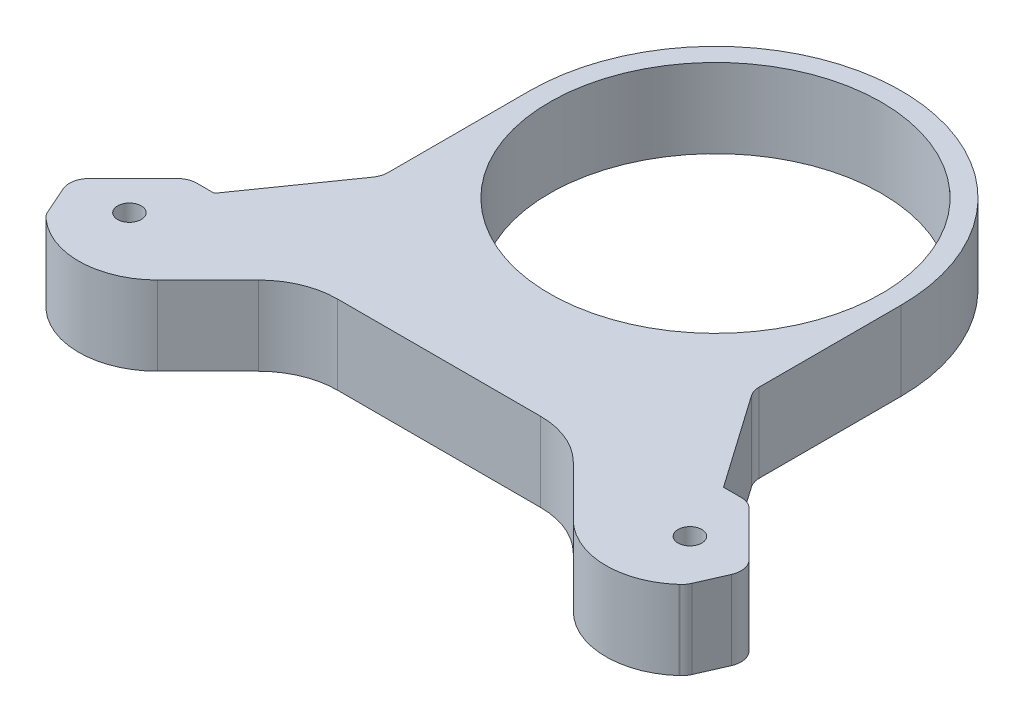
ISO-10303-21;
HEADER;
FILE_DESCRIPTION(('STEP AP214'),'2;1');
FILE_NAME('part.step','',(''),(''),'','','');
FILE_SCHEMA(('AUTOMOTIVE_DESIGN { 1 0 10303 214 1 1 1 1 }'));
ENDSEC;
DATA;
#1=APPLICATION_CONTEXT('core data for automotive mechanical design processes');
#2=APPLICATION_PROTOCOL_DEFINITION('international standard','automotive_design',2000,#1);
#3=PRODUCT_CONTEXT('',#1,'mechanical');
#4=PRODUCT('Part','Part','',(#3));
#5=PRODUCT_RELATED_PRODUCT_CATEGORY('part','',(#4));
#6=PRODUCT_DEFINITION_FORMATION('','',#4);
#7=PRODUCT_DEFINITION_CONTEXT('part definition',#1,'design');
#8=PRODUCT_DEFINITION('design','',#6,#7);
#9=PRODUCT_DEFINITION_SHAPE('','',#8);
#10=(LENGTH_UNIT() NAMED_UNIT(*) SI_UNIT(.MILLI.,.METRE.));
#11=(NAMED_UNIT(*) PLANE_ANGLE_UNIT() SI_UNIT($,.RADIAN.));
#12=(NAMED_UNIT(*) SI_UNIT($,.STERADIAN.) SOLID_ANGLE_UNIT());
#13=UNCERTAINTY_MEASURE_WITH_UNIT(LENGTH_MEASURE(1.E-05),#10,'distance_accuracy_value','');
#14=(GEOMETRIC_REPRESENTATION_CONTEXT(3) GLOBAL_UNCERTAINTY_ASSIGNED_CONTEXT((#13)) GLOBAL_UNIT_ASSIGNED_CONTEXT((#10,
#11,#12)) REPRESENTATION_CONTEXT('',''));
#15=CARTESIAN_POINT('',(0.,0.,0.));
#16=DIRECTION('',(0.,0.,1.));
#17=DIRECTION('',(1.,0.,0.));
#18=AXIS2_PLACEMENT_3D('',#15,#16,#17);
#19=CARTESIAN_POINT('',(0.,10.,0.));
#20=DIRECTION('',(0.,-1.,0.));
#21=DIRECTION('',(0.,0.,1.));
#22=AXIS2_PLACEMENT_3D('',#19,#20,#21);
#23=CYLINDRICAL_SURFACE('',#22,60.);
#24=CARTESIAN_POINT('',(0.,10.,0.));
#25=DIRECTION('',(0.,-1.,0.));
#26=DIRECTION('',(0.,0.,-1.));
#27=AXIS2_PLACEMENT_3D('',#24,#25,#26);
#28=CIRCLE('',#27,60.);
#29=CARTESIAN_POINT('',(-40.0484974665462,10.,44.6779347180691));
#30=VERTEX_POINT('',#29);
#31=CARTESIAN_POINT('',(-40.1334360134549,10.,44.6016514689078));
#32=VERTEX_POINT('',#31);
#33=EDGE_CURVE('E312',#30,#32,#28,.T.);
#34=ORIENTED_EDGE('',*,*,#33,.T.);
#35=DIRECTION('',(0.,-1.,0.));
#36=VECTOR('',#35,1.);
#37=CARTESIAN_POINT('',(-40.1334360134549,10.,44.6016514689078));
#38=LINE('',#37,#36);
#39=CARTESIAN_POINT('',(-40.1334360134549,0.,44.6016514689078));
#40=VERTEX_POINT('',#39);
#41=EDGE_CURVE('E396',#40,#32,#38,.F.);
#42=ORIENTED_EDGE('',*,*,#41,.F.);
#43=CARTESIAN_POINT('',(0.,0.,0.));
#44=DIRECTION('',(0.,-1.,0.));
#45=DIRECTION('',(0.,0.,-1.));
#46=AXIS2_PLACEMENT_3D('',#43,#44,#45);
#47=CIRCLE('',#46,60.);
#48=CARTESIAN_POINT('',(-40.0484974665462,0.,44.6779347180691));
#49=VERTEX_POINT('',#48);
#50=EDGE_CURVE('E286',#49,#40,#47,.T.);
#51=ORIENTED_EDGE('',*,*,#50,.F.);
#52=DIRECTION('',(0.,-1.,0.));
#53=VECTOR('',#52,1.);
#54=CARTESIAN_POINT('',(-40.0484974665462,10.,44.6779347180691));
#55=LINE('',#54,#53);
#56=EDGE_CURVE('E428',#30,#49,#55,.T.);
#57=ORIENTED_EDGE('',*,*,#56,.F.);
#58=EDGE_LOOP('',(#34,#42,#51,#57));
#59=FACE_BOUND('',#58,.T.);
#60=ADVANCED_FACE('F45',(#59),#23,.T.);
#61=CARTESIAN_POINT('',(-50.2677062284699,10.,22.1183201043049));
#62=DIRECTION('',(-0.91531147911944,0.,0.402746689858754));
#63=DIRECTION('',(-0.402746689858754,0.,-0.91531147911944));
#64=AXIS2_PLACEMENT_3D('',#61,#62,#63);
#65=PLANE('',#64);
#66=DIRECTION('',(0.402746689858754,0.,0.91531147911944));
#67=VECTOR('',#66,1.);
#68=CARTESIAN_POINT('',(-50.2677062284699,0.,22.1183201043049));
#69=LINE('',#68,#67);
#70=CARTESIAN_POINT('',(-42.2797149727628,0.,40.2724111882529));
#71=VERTEX_POINT('',#70);
#72=CARTESIAN_POINT('',(-40.7494882106929,0.,43.7501160490168));
#73=VERTEX_POINT('',#72);
#74=EDGE_CURVE('E285',#71,#73,#69,.T.);
#75=ORIENTED_EDGE('',*,*,#74,.T.);
#76=DIRECTION('',(0.,1.,0.));
#77=VECTOR('',#76,1.);
#78=CARTESIAN_POINT('',(-40.7494882106929,0.,43.7501160490168));
#79=LINE('',#78,#77);
#80=CARTESIAN_POINT('',(-40.7494882106929,10.,43.7501160490168));
#81=VERTEX_POINT('',#80);
#82=EDGE_CURVE('E390',#81,#73,#79,.F.);
#83=ORIENTED_EDGE('',*,*,#82,.F.);
#84=DIRECTION('',(0.402746689858754,0.,0.91531147911944));
#85=VECTOR('',#84,1.);
#86=CARTESIAN_POINT('',(-50.2677062284699,10.,22.1183201043049));
#87=LINE('',#86,#85);
#88=CARTESIAN_POINT('',(-42.2797149727628,10.,40.2724111882529));
#89=VERTEX_POINT('',#88);
#90=EDGE_CURVE('E262',#89,#81,#87,.T.);
#91=ORIENTED_EDGE('',*,*,#90,.F.);
#92=DIRECTION('',(0.,-1.,0.));
#93=VECTOR('',#92,1.);
#94=CARTESIAN_POINT('',(-42.2797149727628,10.,40.2724111882529));
#95=LINE('',#94,#93);
#96=EDGE_CURVE('E393',#71,#89,#95,.F.);
#97=ORIENTED_EDGE('',*,*,#96,.F.);
#98=EDGE_LOOP('',(#75,#83,#91,#97));
#99=FACE_BOUND('',#98,.T.);
#100=ADVANCED_FACE('F479',(#99),#65,.T.);
#101=CARTESIAN_POINT('',(-2.13071285864516,10.,-2.13071285864519));
#102=DIRECTION('',(-0.707106781186543,0.,-0.707106781186553));
#103=DIRECTION('',(0.707106781186553,0.,-0.707106781186543));
#104=AXIS2_PLACEMENT_3D('',#101,#102,#103);
#105=PLANE('',#104);
#106=DIRECTION('',(-0.707106781186553,0.,0.707106781186543));
#107=VECTOR('',#106,1.);
#108=CARTESIAN_POINT('',(-2.13071285864516,0.,-2.13071285864519));
#109=LINE('',#108,#107);
#110=CARTESIAN_POINT('',(-36.2007189468559,0.,31.9392932295651));
#111=VERTEX_POINT('',#110);
#112=CARTESIAN_POINT('',(-41.7592032279305,0.,37.4977775106396));
#113=VERTEX_POINT('',#112);
#114=EDGE_CURVE('E289',#111,#113,#109,.T.);
#115=ORIENTED_EDGE('',*,*,#114,.T.);
#116=DIRECTION('',(0.,-1.,0.));
#117=VECTOR('',#116,1.);
#118=CARTESIAN_POINT('',(-41.7592032279305,10.,37.4977775106396));
#119=LINE('',#118,#117);
#120=CARTESIAN_POINT('',(-41.7592032279305,10.,37.4977775106396));
#121=VERTEX_POINT('',#120);
#122=EDGE_CURVE('E384',#121,#113,#119,.T.);
#123=ORIENTED_EDGE('',*,*,#122,.F.);
#124=DIRECTION('',(-0.707106781186553,0.,0.707106781186543));
#125=VECTOR('',#124,1.);
#126=CARTESIAN_POINT('',(-2.13071285864516,10.,-2.13071285864519));
#127=LINE('',#126,#125);
#128=CARTESIAN_POINT('',(-36.2007189468559,10.,31.9392932295651));
#129=VERTEX_POINT('',#128);
#130=EDGE_CURVE('E259',#129,#121,#127,.T.);
#131=ORIENTED_EDGE('',*,*,#130,.F.);
#132=DIRECTION('',(0.,-1.,0.));
#133=VECTOR('',#132,1.);
#134=CARTESIAN_POINT('',(-36.2007189468559,10.,31.939293229565));
#135=LINE('',#134,#133);
#136=EDGE_CURVE('E387',#111,#129,#135,.F.);
#137=ORIENTED_EDGE('',*,*,#136,.F.);
#138=EDGE_LOOP('',(#115,#123,#131,#137));
#139=FACE_BOUND('',#138,.T.);
#140=ADVANCED_FACE('F565',(#139),#105,.T.);
#141=CARTESIAN_POINT('',(-3.00280142795347E-13,10.,31.2070601825318));
#142=DIRECTION('',(0.,0.,1.));
#143=DIRECTION('',(-1.,0.,0.));
#144=AXIS2_PLACEMENT_3D('',#141,#142,#143);
#145=PLANE('',#144);
#146=DIRECTION('',(1.,0.,0.));
#147=VECTOR('',#146,1.);
#148=CARTESIAN_POINT('',(-3.00280142795347E-13,10.,31.2070601825318));
#149=LINE('',#148,#147);
#150=CARTESIAN_POINT('',(-34.4329519938895,10.,31.2070601825314));
#151=VERTEX_POINT('',#150);
#152=CARTESIAN_POINT('',(-32.2233790159762,10.,31.2070601825314));
#153=VERTEX_POINT('',#152);
#154=EDGE_CURVE('E236',#151,#153,#149,.T.);
#155=ORIENTED_EDGE('',*,*,#154,.T.);
#156=DIRECTION('',(0.,-1.,0.));
#157=VECTOR('',#156,1.);
#158=CARTESIAN_POINT('',(-32.2233790159762,10.,31.2070601825314));
#159=LINE('',#158,#157);
#160=CARTESIAN_POINT('',(-32.2233790159762,0.,31.2070601825314));
#161=VERTEX_POINT('',#160);
#162=EDGE_CURVE('E245',#153,#161,#159,.T.);
#163=ORIENTED_EDGE('',*,*,#162,.T.);
#164=DIRECTION('',(1.,0.,0.));
#165=VECTOR('',#164,1.);
#166=CARTESIAN_POINT('',(-3.00280142795347E-13,0.,31.2070601825318));
#167=LINE('',#166,#165);
#168=CARTESIAN_POINT('',(-34.4329519938895,0.,31.2070601825314));
#169=VERTEX_POINT('',#168);
#170=EDGE_CURVE('E292',#169,#161,#167,.T.);
#171=ORIENTED_EDGE('',*,*,#170,.F.);
#172=DIRECTION('',(0.,-1.,0.));
#173=VECTOR('',#172,1.);
#174=CARTESIAN_POINT('',(-34.4329519938895,0.,31.2070601825314));
#175=LINE('',#174,#173);
#176=EDGE_CURVE('E258',#151,#169,#175,.T.);
#177=ORIENTED_EDGE('',*,*,#176,.F.);
#178=EDGE_LOOP('',(#155,#163,#171,#177));
#179=FACE_BOUND('',#178,.T.);
#180=ADVANCED_FACE('F256',(#179),#145,.F.);
#181=CARTESIAN_POINT('',(-6.95968977775582,10.,-4.87322724598562));
#182=DIRECTION('',(0.819152044288995,0.,0.573576436351041));
#183=DIRECTION('',(-0.573576436351041,0.,0.819152044288995));
#184=AXIS2_PLACEMENT_3D('',#181,#182,#183);
#185=PLANE('',#184);
#186=DIRECTION('',(0.573576436351041,0.,-0.819152044288995));
#187=VECTOR('',#186,1.);
#188=CARTESIAN_POINT('',(-6.95968977775582,0.,-4.87322724598562));
#189=LINE('',#188,#187);
#190=CARTESIAN_POINT('',(-23.9521198892775,0.,19.3944779474891));
#191=VERTEX_POINT('',#190);
#192=EDGE_CURVE('E248',#161,#191,#189,.T.);
#193=ORIENTED_EDGE('',*,*,#192,.F.);
#194=ORIENTED_EDGE('',*,*,#162,.F.);
#195=DIRECTION('',(0.573576436351041,0.,-0.819152044288995));
#196=VECTOR('',#195,1.);
#197=CARTESIAN_POINT('',(-6.95968977775582,10.,-4.87322724598562));
#198=LINE('',#197,#196);
#199=CARTESIAN_POINT('',(-23.9521198892775,10.,19.3944779474891));
#200=VERTEX_POINT('',#199);
#201=EDGE_CURVE('E230',#153,#200,#198,.T.);
#202=ORIENTED_EDGE('',*,*,#201,.T.);
#203=DIRECTION('',(0.,-1.,0.));
#204=VECTOR('',#203,1.);
#205=CARTESIAN_POINT('',(-23.9521198892775,10.,19.3944779474891));
#206=LINE('',#205,#204);
#207=EDGE_CURVE('E381',#191,#200,#206,.F.);
#208=ORIENTED_EDGE('',*,*,#207,.F.);
#209=EDGE_LOOP('',(#193,#194,#202,#208));
#210=FACE_BOUND('',#209,.T.);
#211=ADVANCED_FACE('F246',(#210),#185,.F.);
#212=CARTESIAN_POINT('',(-23.5,10.,0.));
#213=DIRECTION('',(-1.,0.,0.));
#214=DIRECTION('',(0.,0.,-1.));
#215=AXIS2_PLACEMENT_3D('',#212,#213,#214);
#216=PLANE('',#215);
#217=DIRECTION('',(0.,0.,1.));
#218=VECTOR('',#217,1.);
#219=CARTESIAN_POINT('',(-23.5,10.,0.));
#220=LINE('',#219,#218);
#221=CARTESIAN_POINT('',(-23.5,10.,0.));
#222=VERTEX_POINT('',#221);
#223=CARTESIAN_POINT('',(-23.5,10.,17.9605368566115));
#224=VERTEX_POINT('',#223);
#225=EDGE_CURVE('E242',#222,#224,#220,.T.);
#226=ORIENTED_EDGE('',*,*,#225,.F.);
#227=DIRECTION('',(0.,-1.,0.));
#228=VECTOR('',#227,1.);
#229=CARTESIAN_POINT('',(-23.5,10.,0.));
#230=LINE('',#229,#228);
#231=CARTESIAN_POINT('',(-23.5,0.,0.));
#232=VERTEX_POINT('',#231);
#233=EDGE_CURVE('E253',#222,#232,#230,.T.);
#234=ORIENTED_EDGE('',*,*,#233,.T.);
#235=DIRECTION('',(0.,0.,1.));
#236=VECTOR('',#235,1.);
#237=CARTESIAN_POINT('',(-23.5,0.,0.));
#238=LINE('',#237,#236);
#239=CARTESIAN_POINT('',(-23.5,0.,17.9605368566115));
#240=VERTEX_POINT('',#239);
#241=EDGE_CURVE('E295',#232,#240,#238,.T.);
#242=ORIENTED_EDGE('',*,*,#241,.T.);
#243=DIRECTION('',(0.,-1.,0.));
#244=VECTOR('',#243,1.);
#245=CARTESIAN_POINT('',(-23.5,10.,17.9605368566115));
#246=LINE('',#245,#244);
#247=EDGE_CURVE('E378',#224,#240,#246,.T.);
#248=ORIENTED_EDGE('',*,*,#247,.F.);
#249=EDGE_LOOP('',(#226,#234,#242,#248));
#250=FACE_BOUND('',#249,.T.);
#251=ADVANCED_FACE('F555',(#250),#216,.T.);
#252=CARTESIAN_POINT('',(23.5,10.,0.));
#253=DIRECTION('',(-1.,0.,0.));
#254=DIRECTION('',(0.,0.,-1.));
#255=AXIS2_PLACEMENT_3D('',#252,#253,#254);
#256=PLANE('',#255);
#257=DIRECTION('',(0.,0.,1.));
#258=VECTOR('',#257,1.);
#259=CARTESIAN_POINT('',(23.5,0.,0.));
#260=LINE('',#259,#258);
#261=CARTESIAN_POINT('',(23.5,0.,0.));
#262=VERTEX_POINT('',#261);
#263=CARTESIAN_POINT('',(23.5,0.,17.9605368566115));
#264=VERTEX_POINT('',#263);
#265=EDGE_CURVE('E298',#262,#264,#260,.T.);
#266=ORIENTED_EDGE('',*,*,#265,.F.);
#267=DIRECTION('',(0.,-1.,0.));
#268=VECTOR('',#267,1.);
#269=CARTESIAN_POINT('',(23.5,10.,0.));
#270=LINE('',#269,#268);
#271=CARTESIAN_POINT('',(23.5,10.,0.));
#272=VERTEX_POINT('',#271);
#273=EDGE_CURVE('E315',#272,#262,#270,.T.);
#274=ORIENTED_EDGE('',*,*,#273,.F.);
#275=DIRECTION('',(0.,0.,1.));
#276=VECTOR('',#275,1.);
#277=CARTESIAN_POINT('',(23.5,10.,0.));
#278=LINE('',#277,#276);
#279=CARTESIAN_POINT('',(23.5,10.,17.9605368566115));
#280=VERTEX_POINT('',#279);
#281=EDGE_CURVE('E267',#272,#280,#278,.T.);
#282=ORIENTED_EDGE('',*,*,#281,.T.);
#283=DIRECTION('',(0.,-1.,0.));
#284=VECTOR('',#283,1.);
#285=CARTESIAN_POINT('',(23.5,10.,17.9605368566115));
#286=LINE('',#285,#284);
#287=EDGE_CURVE('E375',#264,#280,#286,.F.);
#288=ORIENTED_EDGE('',*,*,#287,.F.);
#289=EDGE_LOOP('',(#266,#274,#282,#288));
#290=FACE_BOUND('',#289,.T.);
#291=ADVANCED_FACE('F547',(#290),#256,.F.);
#292=CARTESIAN_POINT('',(6.95968977775582,10.,-4.87322724598562));
#293=DIRECTION('',(0.819152044288995,0.,-0.573576436351041));
#294=DIRECTION('',(0.573576436351041,0.,0.819152044288995));
#295=AXIS2_PLACEMENT_3D('',#292,#293,#294);
#296=PLANE('',#295);
#297=DIRECTION('',(-0.573576436351041,0.,-0.819152044288995));
#298=VECTOR('',#297,1.);
#299=CARTESIAN_POINT('',(6.95968977775582,10.,-4.87322724598562));
#300=LINE('',#299,#298);
#301=CARTESIAN_POINT('',(32.2233790159762,10.,31.2070601825314));
#302=VERTEX_POINT('',#301);
#303=CARTESIAN_POINT('',(23.9521198892775,10.,19.3944779474891));
#304=VERTEX_POINT('',#303);
#305=EDGE_CURVE('E270',#302,#304,#300,.T.);
#306=ORIENTED_EDGE('',*,*,#305,.F.);
#307=DIRECTION('',(0.,-1.,0.));
#308=VECTOR('',#307,1.);
#309=CARTESIAN_POINT('',(32.2233790159762,10.,31.2070601825314));
#310=LINE('',#309,#308);
#311=CARTESIAN_POINT('',(32.2233790159762,0.,31.2070601825314));
#312=VERTEX_POINT('',#311);
#313=EDGE_CURVE('E281',#302,#312,#310,.T.);
#314=ORIENTED_EDGE('',*,*,#313,.T.);
#315=DIRECTION('',(-0.573576436351041,0.,-0.819152044288995));
#316=VECTOR('',#315,1.);
#317=CARTESIAN_POINT('',(6.95968977775582,0.,-4.87322724598562));
#318=LINE('',#317,#316);
#319=CARTESIAN_POINT('',(23.9521198892775,0.,19.3944779474891));
#320=VERTEX_POINT('',#319);
#321=EDGE_CURVE('E301',#312,#320,#318,.T.);
#322=ORIENTED_EDGE('',*,*,#321,.T.);
#323=DIRECTION('',(0.,-1.,0.));
#324=VECTOR('',#323,1.);
#325=CARTESIAN_POINT('',(23.9521198892775,10.,19.3944779474891));
#326=LINE('',#325,#324);
#327=EDGE_CURVE('E372',#304,#320,#326,.T.);
#328=ORIENTED_EDGE('',*,*,#327,.F.);
#329=EDGE_LOOP('',(#306,#314,#322,#328));
#330=FACE_BOUND('',#329,.T.);
#331=ADVANCED_FACE('F539',(#330),#296,.T.);
#332=CARTESIAN_POINT('',(0.,10.,31.2070601825315));
#333=DIRECTION('',(0.,0.,-1.));
#334=DIRECTION('',(1.,0.,0.));
#335=AXIS2_PLACEMENT_3D('',#332,#333,#334);
#336=PLANE('',#335);
#337=DIRECTION('',(-1.,0.,0.));
#338=VECTOR('',#337,1.);
#339=CARTESIAN_POINT('',(0.,0.,31.2070601825315));
#340=LINE('',#339,#338);
#341=CARTESIAN_POINT('',(34.4329519938894,0.,31.2070601825314));
#342=VERTEX_POINT('',#341);
#343=EDGE_CURVE('E304',#342,#312,#340,.T.);
#344=ORIENTED_EDGE('',*,*,#343,.T.);
#345=ORIENTED_EDGE('',*,*,#313,.F.);
#346=DIRECTION('',(-1.,0.,0.));
#347=VECTOR('',#346,1.);
#348=CARTESIAN_POINT('',(0.,10.,31.2070601825315));
#349=LINE('',#348,#347);
#350=CARTESIAN_POINT('',(34.4329519938894,10.,31.2070601825314));
#351=VERTEX_POINT('',#350);
#352=EDGE_CURVE('E273',#351,#302,#349,.T.);
#353=ORIENTED_EDGE('',*,*,#352,.F.);
#354=DIRECTION('',(0.,-1.,0.));
#355=VECTOR('',#354,1.);
#356=CARTESIAN_POINT('',(34.4329519938894,10.,31.2070601825314));
#357=LINE('',#356,#355);
#358=EDGE_CURVE('E369',#342,#351,#357,.F.);
#359=ORIENTED_EDGE('',*,*,#358,.F.);
#360=EDGE_LOOP('',(#344,#345,#353,#359));
#361=FACE_BOUND('',#360,.T.);
#362=ADVANCED_FACE('F534',(#361),#336,.T.);
#363=CARTESIAN_POINT('',(2.13071285864504,10.,-2.13071285864508));
#364=DIRECTION('',(-0.707106781186541,0.,0.707106781186554));
#365=DIRECTION('',(-0.707106781186554,0.,-0.707106781186541));
#366=AXIS2_PLACEMENT_3D('',#363,#364,#365);
#367=PLANE('',#366);
#368=DIRECTION('',(0.707106781186554,0.,0.707106781186541));
#369=VECTOR('',#368,1.);
#370=CARTESIAN_POINT('',(2.13071285864504,0.,-2.13071285864508));
#371=LINE('',#370,#369);
#372=CARTESIAN_POINT('',(36.2007189468558,0.,31.9392932295651));
#373=VERTEX_POINT('',#372);
#374=CARTESIAN_POINT('',(41.7592032279304,0.,37.4977775106396));
#375=VERTEX_POINT('',#374);
#376=EDGE_CURVE('E306',#373,#375,#371,.T.);
#377=ORIENTED_EDGE('',*,*,#376,.F.);
#378=DIRECTION('',(0.,-1.,0.));
#379=VECTOR('',#378,1.);
#380=CARTESIAN_POINT('',(36.2007189468558,0.,31.9392932295651));
#381=LINE('',#380,#379);
#382=CARTESIAN_POINT('',(36.2007189468558,10.,31.9392932295651));
#383=VERTEX_POINT('',#382);
#384=EDGE_CURVE('E363',#383,#373,#381,.T.);
#385=ORIENTED_EDGE('',*,*,#384,.F.);
#386=DIRECTION('',(0.707106781186554,0.,0.707106781186541));
#387=VECTOR('',#386,1.);
#388=CARTESIAN_POINT('',(2.13071285864504,10.,-2.13071285864508));
#389=LINE('',#388,#387);
#390=CARTESIAN_POINT('',(41.7592032279304,10.,37.4977775106396));
#391=VERTEX_POINT('',#390);
#392=EDGE_CURVE('E275',#383,#391,#389,.T.);
#393=ORIENTED_EDGE('',*,*,#392,.T.);
#394=DIRECTION('',(0.,-1.,0.));
#395=VECTOR('',#394,1.);
#396=CARTESIAN_POINT('',(41.7592032279304,10.,37.4977775106396));
#397=LINE('',#396,#395);
#398=EDGE_CURVE('E366',#375,#391,#397,.F.);
#399=ORIENTED_EDGE('',*,*,#398,.F.);
#400=EDGE_LOOP('',(#377,#385,#393,#399));
#401=FACE_BOUND('',#400,.T.);
#402=ADVANCED_FACE('F526',(#401),#367,.F.);
#403=CARTESIAN_POINT('',(50.2677062284698,10.,22.1183201043035));
#404=DIRECTION('',(-0.915311479119449,0.,-0.402746689858733));
#405=DIRECTION('',(0.402746689858733,0.,-0.915311479119449));
#406=AXIS2_PLACEMENT_3D('',#403,#404,#405);
#407=PLANE('',#406);
#408=DIRECTION('',(-0.402746689858733,0.,0.915311479119449));
#409=VECTOR('',#408,1.);
#410=CARTESIAN_POINT('',(50.2677062284698,0.,22.1183201043035));
#411=LINE('',#410,#409);
#412=CARTESIAN_POINT('',(42.2797149727627,0.,40.2724111882528));
#413=VERTEX_POINT('',#412);
#414=CARTESIAN_POINT('',(40.7494882106929,0.,43.7501160490168));
#415=VERTEX_POINT('',#414);
#416=EDGE_CURVE('E309',#413,#415,#411,.T.);
#417=ORIENTED_EDGE('',*,*,#416,.F.);
#418=DIRECTION('',(0.,-1.,0.));
#419=VECTOR('',#418,1.);
#420=CARTESIAN_POINT('',(42.2797149727627,10.,40.2724111882528));
#421=LINE('',#420,#419);
#422=CARTESIAN_POINT('',(42.2797149727627,10.,40.2724111882528));
#423=VERTEX_POINT('',#422);
#424=EDGE_CURVE('E345',#423,#413,#421,.T.);
#425=ORIENTED_EDGE('',*,*,#424,.F.);
#426=DIRECTION('',(-0.402746689858733,0.,0.915311479119449));
#427=VECTOR('',#426,1.);
#428=CARTESIAN_POINT('',(50.2677062284698,10.,22.1183201043035));
#429=LINE('',#428,#427);
#430=CARTESIAN_POINT('',(40.7494882106929,10.,43.7501160490168));
#431=VERTEX_POINT('',#430);
#432=EDGE_CURVE('E278',#423,#431,#429,.T.);
#433=ORIENTED_EDGE('',*,*,#432,.T.);
#434=DIRECTION('',(0.,-1.,0.));
#435=VECTOR('',#434,1.);
#436=CARTESIAN_POINT('',(40.7494882106929,10.,43.7501160490168));
#437=LINE('',#436,#435);
#438=EDGE_CURVE('E348',#415,#431,#437,.F.);
#439=ORIENTED_EDGE('',*,*,#438,.F.);
#440=EDGE_LOOP('',(#417,#425,#433,#439));
#441=FACE_BOUND('',#440,.T.);
#442=ADVANCED_FACE('F518',(#441),#407,.F.);
#443=CARTESIAN_POINT('',(40.1334360134549,0.,44.6016514689078));
#444=VERTEX_POINT('',#443);
#445=CARTESIAN_POINT('',(40.0484974665462,0.,44.6779347180691));
#446=VERTEX_POINT('',#445);
#447=EDGE_CURVE('E282',#444,#446,#47,.T.);
#448=ORIENTED_EDGE('',*,*,#447,.F.);
#449=DIRECTION('',(0.,-1.,0.));
#450=VECTOR('',#449,1.);
#451=CARTESIAN_POINT('',(40.1334360134549,10.,44.6016514689078));
#452=LINE('',#451,#450);
#453=CARTESIAN_POINT('',(40.1334360134549,10.,44.6016514689078));
#454=VERTEX_POINT('',#453);
#455=EDGE_CURVE('E252',#454,#444,#452,.T.);
#456=ORIENTED_EDGE('',*,*,#455,.F.);
#457=CARTESIAN_POINT('',(40.0484974665462,10.,44.6779347180691));
#458=VERTEX_POINT('',#457);
#459=EDGE_CURVE('E471',#454,#458,#28,.T.);
#460=ORIENTED_EDGE('',*,*,#459,.T.);
#461=DIRECTION('',(0.,-1.,0.));
#462=VECTOR('',#461,1.);
#463=CARTESIAN_POINT('',(40.0484974665462,10.,44.6779347180691));
#464=LINE('',#463,#462);
#465=EDGE_CURVE('E414',#446,#458,#464,.F.);
#466=ORIENTED_EDGE('',*,*,#465,.F.);
#467=EDGE_LOOP('',(#448,#456,#460,#466));
#468=FACE_BOUND('',#467,.T.);
#469=ADVANCED_FACE('F509',(#468),#23,.T.);
#470=CARTESIAN_POINT('',(0.,0.,0.));
#471=DIRECTION('',(0.,1.,0.));
#472=DIRECTION('',(0.,0.,-1.));
#473=AXIS2_PLACEMENT_3D('',#470,#471,#472);
#474=PLANE('',#473);
#475=CARTESIAN_POINT('',(-35.4684858998222,0.,38.7070601825314));
#476=DIRECTION('',(0.,-1.,0.));
#477=DIRECTION('',(0.,0.,-1.));
#478=AXIS2_PLACEMENT_3D('',#475,#476,#477);
#479=CIRCLE('',#478,1.5);
#480=CARTESIAN_POINT('',(-35.4684858998222,0.,37.2070601825314));
#481=VERTEX_POINT('',#480);
#482=EDGE_CURVE('E327',#481,#481,#479,.F.);
#483=ORIENTED_EDGE('',*,*,#482,.T.);
#484=EDGE_LOOP('',(#483));
#485=FACE_BOUND('',#484,.T.);
#486=CARTESIAN_POINT('',(35.4684858998222,0.,38.7070601825314));
#487=DIRECTION('',(0.,-1.,0.));
#488=DIRECTION('',(0.,0.,-1.));
#489=AXIS2_PLACEMENT_3D('',#486,#487,#488);
#490=CIRCLE('',#489,1.5);
#491=CARTESIAN_POINT('',(35.4684858998222,0.,37.2070601825314));
#492=VERTEX_POINT('',#491);
#493=EDGE_CURVE('E465',#492,#492,#490,.F.);
#494=ORIENTED_EDGE('',*,*,#493,.T.);
#495=EDGE_LOOP('',(#494));
#496=FACE_BOUND('',#495,.T.);
#497=DIRECTION('',(-0.707106781186546,0.,-0.707106781186549));
#498=VECTOR('',#497,1.);
#499=CARTESIAN_POINT('',(17.,0.,35.));
#500=LINE('',#499,#498);
#501=CARTESIAN_POINT('',(26.302680076923,0.,44.302680076923));
#502=VERTEX_POINT('',#501);
#503=CARTESIAN_POINT('',(19.9289321881345,0.,37.9289321881345));
#504=VERTEX_POINT('',#503);
#505=EDGE_CURVE('E452',#502,#504,#500,.T.);
#506=ORIENTED_EDGE('',*,*,#505,.T.);
#507=CARTESIAN_POINT('',(12.857864376269,0.,45.));
#508=DIRECTION('',(0.,-1.,0.));
#509=DIRECTION('',(0.,0.,-1.));
#510=AXIS2_PLACEMENT_3D('',#507,#508,#509);
#511=CIRCLE('',#510,10.);
#512=CARTESIAN_POINT('',(12.857864376269,0.,35.));
#513=VERTEX_POINT('',#512);
#514=EDGE_CURVE('E430',#513,#504,#511,.T.);
#515=ORIENTED_EDGE('',*,*,#514,.F.);
#516=DIRECTION('',(-1.,0.,0.));
#517=VECTOR('',#516,1.);
#518=CARTESIAN_POINT('',(17.,0.,35.));
#519=LINE('',#518,#517);
#520=CARTESIAN_POINT('',(-12.857864376269,0.,35.));
#521=VERTEX_POINT('',#520);
#522=EDGE_CURVE('E446',#513,#521,#519,.T.);
#523=ORIENTED_EDGE('',*,*,#522,.T.);
#524=CARTESIAN_POINT('',(-12.857864376269,0.,45.));
#525=DIRECTION('',(0.,-1.,0.));
#526=DIRECTION('',(0.,0.,-1.));
#527=AXIS2_PLACEMENT_3D('',#524,#525,#526);
#528=CIRCLE('',#527,10.);
#529=CARTESIAN_POINT('',(-19.9289321881345,0.,37.9289321881345));
#530=VERTEX_POINT('',#529);
#531=EDGE_CURVE('E53',#530,#521,#528,.T.);
#532=ORIENTED_EDGE('',*,*,#531,.F.);
#533=DIRECTION('',(-0.707106781186546,0.,0.707106781186549));
#534=VECTOR('',#533,1.);
#535=CARTESIAN_POINT('',(-17.,0.,35.));
#536=LINE('',#535,#534);
#537=CARTESIAN_POINT('',(-26.302680076923,0.,44.302680076923));
#538=VERTEX_POINT('',#537);
#539=EDGE_CURVE('E451',#530,#538,#536,.T.);
#540=ORIENTED_EDGE('',*,*,#539,.T.);
#541=CARTESIAN_POINT('',(-33.3737478887885,0.,37.2316122650576));
#542=DIRECTION('',(0.,-1.,0.));
#543=DIRECTION('',(0.,0.,-1.));
#544=AXIS2_PLACEMENT_3D('',#541,#542,#543);
#545=CIRCLE('',#544,10.);
#546=EDGE_CURVE('E410',#49,#538,#545,.F.);
#547=ORIENTED_EDGE('',*,*,#546,.F.);
#548=ORIENTED_EDGE('',*,*,#50,.T.);
#549=CARTESIAN_POINT('',(-38.4612095128943,0.,42.7432493243699));
#550=DIRECTION('',(0.,-1.,0.));
#551=DIRECTION('',(0.,0.,-1.));
#552=AXIS2_PLACEMENT_3D('',#549,#550,#551);
#553=CIRCLE('',#552,2.5);
#554=EDGE_CURVE('E333',#73,#40,#553,.F.);
#555=ORIENTED_EDGE('',*,*,#554,.F.);
#556=ORIENTED_EDGE('',*,*,#74,.F.);
#557=CARTESIAN_POINT('',(-39.9914362749642,0.,39.265544463606));
#558=DIRECTION('',(0.,-1.,0.));
#559=DIRECTION('',(0.,0.,-1.));
#560=AXIS2_PLACEMENT_3D('',#557,#558,#559);
#561=CIRCLE('',#560,2.5);
#562=EDGE_CURVE('E335',#113,#71,#561,.F.);
#563=ORIENTED_EDGE('',*,*,#562,.F.);
#564=ORIENTED_EDGE('',*,*,#114,.F.);
#565=CARTESIAN_POINT('',(-34.4329519938895,0.,33.7070601825314));
#566=DIRECTION('',(0.,-1.,0.));
#567=DIRECTION('',(0.,0.,-1.));
#568=AXIS2_PLACEMENT_3D('',#565,#566,#567);
#569=CIRCLE('',#568,2.5);
#570=EDGE_CURVE('E337',#169,#111,#569,.F.);
#571=ORIENTED_EDGE('',*,*,#570,.F.);
#572=ORIENTED_EDGE('',*,*,#170,.T.);
#573=ORIENTED_EDGE('',*,*,#192,.T.);
#574=CARTESIAN_POINT('',(-26.,0.,17.9605368566115));
#575=DIRECTION('',(0.,-1.,0.));
#576=DIRECTION('',(0.,0.,-1.));
#577=AXIS2_PLACEMENT_3D('',#574,#575,#576);
#578=CIRCLE('',#577,2.5);
#579=EDGE_CURVE('E403',#240,#191,#578,.T.);
#580=ORIENTED_EDGE('',*,*,#579,.F.);
#581=ORIENTED_EDGE('',*,*,#241,.F.);
#582=CARTESIAN_POINT('',(0.,0.,0.));
#583=DIRECTION('',(0.,-1.,0.));
#584=DIRECTION('',(0.,0.,-1.));
#585=AXIS2_PLACEMENT_3D('',#582,#583,#584);
#586=CIRCLE('',#585,23.5);
#587=EDGE_CURVE('E323',#232,#262,#586,.T.);
#588=ORIENTED_EDGE('',*,*,#587,.T.);
#589=ORIENTED_EDGE('',*,*,#265,.T.);
#590=CARTESIAN_POINT('',(26.,0.,17.9605368566115));
#591=DIRECTION('',(0.,-1.,0.));
#592=DIRECTION('',(0.,0.,-1.));
#593=AXIS2_PLACEMENT_3D('',#590,#591,#592);
#594=CIRCLE('',#593,2.5);
#595=EDGE_CURVE('E399',#320,#264,#594,.T.);
#596=ORIENTED_EDGE('',*,*,#595,.F.);
#597=ORIENTED_EDGE('',*,*,#321,.F.);
#598=ORIENTED_EDGE('',*,*,#343,.F.);
#599=CARTESIAN_POINT('',(34.4329519938894,0.,33.7070601825314));
#600=DIRECTION('',(0.,-1.,0.));
#601=DIRECTION('',(0.,0.,-1.));
#602=AXIS2_PLACEMENT_3D('',#599,#600,#601);
#603=CIRCLE('',#602,2.5);
#604=EDGE_CURVE('E339',#373,#342,#603,.F.);
#605=ORIENTED_EDGE('',*,*,#604,.F.);
#606=ORIENTED_EDGE('',*,*,#376,.T.);
#607=CARTESIAN_POINT('',(39.9914362749641,0.,39.265544463606));
#608=DIRECTION('',(0.,-1.,0.));
#609=DIRECTION('',(0.,0.,-1.));
#610=AXIS2_PLACEMENT_3D('',#607,#608,#609);
#611=CIRCLE('',#610,2.5);
#612=EDGE_CURVE('E341',#413,#375,#611,.F.);
#613=ORIENTED_EDGE('',*,*,#612,.F.);
#614=ORIENTED_EDGE('',*,*,#416,.T.);
#615=CARTESIAN_POINT('',(38.4612095128942,0.,42.74324932437));
#616=DIRECTION('',(0.,-1.,0.));
#617=DIRECTION('',(0.,0.,-1.));
#618=AXIS2_PLACEMENT_3D('',#615,#616,#617);
#619=CIRCLE('',#618,2.5);
#620=EDGE_CURVE('E343',#444,#415,#619,.F.);
#621=ORIENTED_EDGE('',*,*,#620,.F.);
#622=ORIENTED_EDGE('',*,*,#447,.T.);
#623=CARTESIAN_POINT('',(33.3737478887885,0.,37.2316122650576));
#624=DIRECTION('',(0.,-1.,0.));
#625=DIRECTION('',(0.,0.,-1.));
#626=AXIS2_PLACEMENT_3D('',#623,#624,#625);
#627=CIRCLE('',#626,10.);
#628=EDGE_CURVE('E412',#502,#446,#627,.F.);
#629=ORIENTED_EDGE('',*,*,#628,.F.);
#630=EDGE_LOOP('',(#506,#515,#523,#532,#540,#547,#548,#555,#556,#563,#564,#571,#572,#573,#580,
#581,#588,#589,#596,#597,#598,#605,#606,#613,#614,#621,#622,#629));
#631=FACE_BOUND('',#630,.T.);
#632=CARTESIAN_POINT('',(0.,0.,0.));
#633=DIRECTION('',(0.,-1.,0.));
#634=DIRECTION('',(0.,0.,-1.));
#635=AXIS2_PLACEMENT_3D('',#632,#633,#634);
#636=CIRCLE('',#635,21.);
#637=CARTESIAN_POINT('',(0.,0.,-21.));
#638=VERTEX_POINT('',#637);
#639=EDGE_CURVE('E324',#638,#638,#636,.T.);
#640=ORIENTED_EDGE('',*,*,#639,.F.);
#641=EDGE_LOOP('',(#640));
#642=FACE_BOUND('',#641,.T.);
#643=ADVANCED_FACE('F448',(#485,#496,#631,#642),#474,.F.);
#644=CARTESIAN_POINT('',(0.,10.,0.));
#645=DIRECTION('',(0.,1.,0.));
#646=DIRECTION('',(0.,0.,-1.));
#647=AXIS2_PLACEMENT_3D('',#644,#645,#646);
#648=PLANE('',#647);
#649=ORIENTED_EDGE('',*,*,#459,.F.);
#650=CARTESIAN_POINT('',(38.4612095128942,10.,42.74324932437));
#651=DIRECTION('',(0.,-1.,0.));
#652=DIRECTION('',(0.,0.,-1.));
#653=AXIS2_PLACEMENT_3D('',#650,#651,#652);
#654=CIRCLE('',#653,2.5);
#655=EDGE_CURVE('E361',#431,#454,#654,.T.);
#656=ORIENTED_EDGE('',*,*,#655,.F.);
#657=ORIENTED_EDGE('',*,*,#432,.F.);
#658=CARTESIAN_POINT('',(39.9914362749641,10.,39.265544463606));
#659=DIRECTION('',(0.,-1.,0.));
#660=DIRECTION('',(0.,0.,-1.));
#661=AXIS2_PLACEMENT_3D('',#658,#659,#660);
#662=CIRCLE('',#661,2.5);
#663=EDGE_CURVE('E359',#391,#423,#662,.T.);
#664=ORIENTED_EDGE('',*,*,#663,.F.);
#665=ORIENTED_EDGE('',*,*,#392,.F.);
#666=CARTESIAN_POINT('',(34.4329519938894,10.,33.7070601825314));
#667=DIRECTION('',(0.,-1.,0.));
#668=DIRECTION('',(0.,0.,-1.));
#669=AXIS2_PLACEMENT_3D('',#666,#667,#668);
#670=CIRCLE('',#669,2.5);
#671=EDGE_CURVE('E357',#351,#383,#670,.T.);
#672=ORIENTED_EDGE('',*,*,#671,.F.);
#673=ORIENTED_EDGE('',*,*,#352,.T.);
#674=ORIENTED_EDGE('',*,*,#305,.T.);
#675=CARTESIAN_POINT('',(26.,10.,17.9605368566115));
#676=DIRECTION('',(0.,-1.,0.));
#677=DIRECTION('',(0.,0.,-1.));
#678=AXIS2_PLACEMENT_3D('',#675,#676,#677);
#679=CIRCLE('',#678,2.5);
#680=EDGE_CURVE('E401',#280,#304,#679,.F.);
#681=ORIENTED_EDGE('',*,*,#680,.F.);
#682=ORIENTED_EDGE('',*,*,#281,.F.);
#683=CARTESIAN_POINT('',(0.,10.,0.));
#684=DIRECTION('',(0.,-1.,0.));
#685=DIRECTION('',(0.,0.,-1.));
#686=AXIS2_PLACEMENT_3D('',#683,#684,#685);
#687=CIRCLE('',#686,23.5);
#688=EDGE_CURVE('E328',#222,#272,#687,.T.);
#689=ORIENTED_EDGE('',*,*,#688,.F.);
#690=ORIENTED_EDGE('',*,*,#225,.T.);
#691=CARTESIAN_POINT('',(-26.,10.,17.9605368566115));
#692=DIRECTION('',(0.,-1.,0.));
#693=DIRECTION('',(0.,0.,-1.));
#694=AXIS2_PLACEMENT_3D('',#691,#692,#693);
#695=CIRCLE('',#694,2.5);
#696=EDGE_CURVE('E238',#200,#224,#695,.F.);
#697=ORIENTED_EDGE('',*,*,#696,.F.);
#698=ORIENTED_EDGE('',*,*,#201,.F.);
#699=ORIENTED_EDGE('',*,*,#154,.F.);
#700=CARTESIAN_POINT('',(-34.4329519938895,10.,33.7070601825314));
#701=DIRECTION('',(0.,-1.,0.));
#702=DIRECTION('',(0.,0.,-1.));
#703=AXIS2_PLACEMENT_3D('',#700,#701,#702);
#704=CIRCLE('',#703,2.5);
#705=EDGE_CURVE('E355',#129,#151,#704,.T.);
#706=ORIENTED_EDGE('',*,*,#705,.F.);
#707=ORIENTED_EDGE('',*,*,#130,.T.);
#708=CARTESIAN_POINT('',(-39.9914362749642,10.,39.265544463606));
#709=DIRECTION('',(0.,-1.,0.));
#710=DIRECTION('',(0.,0.,-1.));
#711=AXIS2_PLACEMENT_3D('',#708,#709,#710);
#712=CIRCLE('',#711,2.5);
#713=EDGE_CURVE('E353',#89,#121,#712,.T.);
#714=ORIENTED_EDGE('',*,*,#713,.F.);
#715=ORIENTED_EDGE('',*,*,#90,.T.);
#716=CARTESIAN_POINT('',(-38.4612095128943,10.,42.7432493243699));
#717=DIRECTION('',(0.,-1.,0.));
#718=DIRECTION('',(0.,0.,-1.));
#719=AXIS2_PLACEMENT_3D('',#716,#717,#718);
#720=CIRCLE('',#719,2.5);
#721=EDGE_CURVE('E351',#32,#81,#720,.T.);
#722=ORIENTED_EDGE('',*,*,#721,.F.);
#723=ORIENTED_EDGE('',*,*,#33,.F.);
#724=CARTESIAN_POINT('',(-33.3737478887885,10.,37.2316122650576));
#725=DIRECTION('',(0.,-1.,0.));
#726=DIRECTION('',(0.,0.,-1.));
#727=AXIS2_PLACEMENT_3D('',#724,#725,#726);
#728=CIRCLE('',#727,10.);
#729=CARTESIAN_POINT('',(-26.302680076923,10.,44.302680076923));
#730=VERTEX_POINT('',#729);
#731=EDGE_CURVE('E60',#730,#30,#728,.T.);
#732=ORIENTED_EDGE('',*,*,#731,.F.);
#733=DIRECTION('',(-0.707106781186546,0.,0.707106781186549));
#734=VECTOR('',#733,1.);
#735=CARTESIAN_POINT('',(-17.,10.,35.));
#736=LINE('',#735,#734);
#737=CARTESIAN_POINT('',(-19.9289321881345,10.,37.9289321881345));
#738=VERTEX_POINT('',#737);
#739=EDGE_CURVE('E468',#738,#730,#736,.T.);
#740=ORIENTED_EDGE('',*,*,#739,.F.);
#741=CARTESIAN_POINT('',(-12.857864376269,10.,45.));
#742=DIRECTION('',(0.,-1.,0.));
#743=DIRECTION('',(0.,0.,-1.));
#744=AXIS2_PLACEMENT_3D('',#741,#742,#743);
#745=CIRCLE('',#744,10.);
#746=CARTESIAN_POINT('',(-12.857864376269,10.,35.));
#747=VERTEX_POINT('',#746);
#748=EDGE_CURVE('E11',#747,#738,#745,.F.);
#749=ORIENTED_EDGE('',*,*,#748,.F.);
#750=DIRECTION('',(-1.,0.,0.));
#751=VECTOR('',#750,1.);
#752=CARTESIAN_POINT('',(17.,10.,35.));
#753=LINE('',#752,#751);
#754=CARTESIAN_POINT('',(12.857864376269,10.,35.));
#755=VERTEX_POINT('',#754);
#756=EDGE_CURVE('E492',#755,#747,#753,.T.);
#757=ORIENTED_EDGE('',*,*,#756,.F.);
#758=CARTESIAN_POINT('',(12.857864376269,10.,45.));
#759=DIRECTION('',(0.,-1.,0.));
#760=DIRECTION('',(0.,0.,-1.));
#761=AXIS2_PLACEMENT_3D('',#758,#759,#760);
#762=CIRCLE('',#761,10.);
#763=CARTESIAN_POINT('',(19.9289321881345,10.,37.9289321881345));
#764=VERTEX_POINT('',#763);
#765=EDGE_CURVE('E433',#764,#755,#762,.F.);
#766=ORIENTED_EDGE('',*,*,#765,.F.);
#767=DIRECTION('',(-0.707106781186546,0.,-0.707106781186549));
#768=VECTOR('',#767,1.);
#769=CARTESIAN_POINT('',(17.,10.,35.));
#770=LINE('',#769,#768);
#771=CARTESIAN_POINT('',(26.302680076923,10.,44.302680076923));
#772=VERTEX_POINT('',#771);
#773=EDGE_CURVE('E454',#772,#764,#770,.T.);
#774=ORIENTED_EDGE('',*,*,#773,.F.);
#775=CARTESIAN_POINT('',(33.3737478887885,10.,37.2316122650576));
#776=DIRECTION('',(0.,-1.,0.));
#777=DIRECTION('',(0.,0.,-1.));
#778=AXIS2_PLACEMENT_3D('',#775,#776,#777);
#779=CIRCLE('',#778,10.);
#780=EDGE_CURVE('E418',#458,#772,#779,.T.);
#781=ORIENTED_EDGE('',*,*,#780,.F.);
#782=EDGE_LOOP('',(#649,#656,#657,#664,#665,#672,#673,#674,#681,#682,#689,#690,#697,#698,#699,
#706,#707,#714,#715,#722,#723,#732,#740,#749,#757,#766,#774,#781));
#783=FACE_BOUND('',#782,.T.);
#784=CARTESIAN_POINT('',(-35.4684858998222,10.,38.7070601825314));
#785=DIRECTION('',(0.,-1.,0.));
#786=DIRECTION('',(0.,0.,-1.));
#787=AXIS2_PLACEMENT_3D('',#784,#785,#786);
#788=CIRCLE('',#787,1.5);
#789=CARTESIAN_POINT('',(-35.4684858998222,10.,37.2070601825314));
#790=VERTEX_POINT('',#789);
#791=EDGE_CURVE('E459',#790,#790,#788,.T.);
#792=ORIENTED_EDGE('',*,*,#791,.T.);
#793=EDGE_LOOP('',(#792));
#794=FACE_BOUND('',#793,.T.);
#795=CARTESIAN_POINT('',(35.4684858998222,10.,38.7070601825314));
#796=DIRECTION('',(0.,-1.,0.));
#797=DIRECTION('',(0.,0.,1.));
#798=AXIS2_PLACEMENT_3D('',#795,#796,#797);
#799=CIRCLE('',#798,1.5);
#800=CARTESIAN_POINT('',(35.4684858998222,10.,40.2070601825314));
#801=VERTEX_POINT('',#800);
#802=EDGE_CURVE('E462',#801,#801,#799,.T.);
#803=ORIENTED_EDGE('',*,*,#802,.T.);
#804=EDGE_LOOP('',(#803));
#805=FACE_BOUND('',#804,.T.);
#806=CARTESIAN_POINT('',(0.,10.,0.));
#807=DIRECTION('',(0.,-1.,0.));
#808=DIRECTION('',(0.,0.,-1.));
#809=AXIS2_PLACEMENT_3D('',#806,#807,#808);
#810=CIRCLE('',#809,21.);
#811=CARTESIAN_POINT('',(0.,10.,-21.));
#812=VERTEX_POINT('',#811);
#813=EDGE_CURVE('E320',#812,#812,#810,.T.);
#814=ORIENTED_EDGE('',*,*,#813,.T.);
#815=EDGE_LOOP('',(#814));
#816=FACE_BOUND('',#815,.T.);
#817=ADVANCED_FACE('F233',(#783,#794,#805,#816),#648,.T.);
#818=CARTESIAN_POINT('',(0.,10.,0.));
#819=DIRECTION('',(0.,-1.,0.));
#820=DIRECTION('',(0.,0.,1.));
#821=AXIS2_PLACEMENT_3D('',#818,#819,#820);
#822=CYLINDRICAL_SURFACE('',#821,21.);
#823=ORIENTED_EDGE('',*,*,#813,.F.);
#824=EDGE_LOOP('',(#823));
#825=FACE_BOUND('',#824,.T.);
#826=ORIENTED_EDGE('',*,*,#639,.T.);
#827=EDGE_LOOP('',(#826));
#828=FACE_BOUND('',#827,.T.);
#829=ADVANCED_FACE('F672',(#825,#828),#822,.F.);
#830=CARTESIAN_POINT('',(0.,10.,0.));
#831=DIRECTION('',(0.,-1.,0.));
#832=DIRECTION('',(0.,0.,1.));
#833=AXIS2_PLACEMENT_3D('',#830,#831,#832);
#834=CYLINDRICAL_SURFACE('',#833,23.5);
#835=ORIENTED_EDGE('',*,*,#233,.F.);
#836=ORIENTED_EDGE('',*,*,#688,.T.);
#837=ORIENTED_EDGE('',*,*,#273,.T.);
#838=ORIENTED_EDGE('',*,*,#587,.F.);
#839=EDGE_LOOP('',(#835,#836,#837,#838));
#840=FACE_BOUND('',#839,.T.);
#841=ADVANCED_FACE('F551',(#840),#834,.T.);
#842=CARTESIAN_POINT('',(35.4684858998222,-0.000999999999999265,38.7070601825314));
#843=DIRECTION('',(0.,1.,0.));
#844=DIRECTION('',(0.,0.,-1.));
#845=AXIS2_PLACEMENT_3D('',#842,#843,#844);
#846=CYLINDRICAL_SURFACE('',#845,1.5);
#847=ORIENTED_EDGE('',*,*,#802,.F.);
#848=EDGE_LOOP('',(#847));
#849=FACE_BOUND('',#848,.T.);
#850=ORIENTED_EDGE('',*,*,#493,.F.);
#851=EDGE_LOOP('',(#850));
#852=FACE_BOUND('',#851,.T.);
#853=ADVANCED_FACE('F689',(#849,#852),#846,.F.);
#854=CARTESIAN_POINT('',(-35.4684858998222,-0.000999999999999265,38.7070601825314));
#855=DIRECTION('',(0.,1.,0.));
#856=DIRECTION('',(0.,0.,-1.));
#857=AXIS2_PLACEMENT_3D('',#854,#855,#856);
#858=CYLINDRICAL_SURFACE('',#857,1.5);
#859=ORIENTED_EDGE('',*,*,#791,.F.);
#860=EDGE_LOOP('',(#859));
#861=FACE_BOUND('',#860,.T.);
#862=ORIENTED_EDGE('',*,*,#482,.F.);
#863=EDGE_LOOP('',(#862));
#864=FACE_BOUND('',#863,.T.);
#865=ADVANCED_FACE('F698',(#861,#864),#858,.F.);
#866=CARTESIAN_POINT('',(-17.,10.,35.));
#867=DIRECTION('',(-0.707106781186549,0.,-0.707106781186546));
#868=DIRECTION('',(0.707106781186546,0.,-0.707106781186549));
#869=AXIS2_PLACEMENT_3D('',#866,#867,#868);
#870=PLANE('',#869);
#871=ORIENTED_EDGE('',*,*,#739,.T.);
#872=DIRECTION('',(0.,-1.,0.));
#873=VECTOR('',#872,1.);
#874=CARTESIAN_POINT('',(-26.302680076923,10.,44.302680076923));
#875=LINE('',#874,#873);
#876=EDGE_CURVE('E65',#538,#730,#875,.F.);
#877=ORIENTED_EDGE('',*,*,#876,.F.);
#878=ORIENTED_EDGE('',*,*,#539,.F.);
#879=DIRECTION('',(0.,-1.,0.));
#880=VECTOR('',#879,1.);
#881=CARTESIAN_POINT('',(-19.9289321881345,0.,37.9289321881345));
#882=LINE('',#881,#880);
#883=EDGE_CURVE('E426',#738,#530,#882,.T.);
#884=ORIENTED_EDGE('',*,*,#883,.F.);
#885=EDGE_LOOP('',(#871,#877,#878,#884));
#886=FACE_BOUND('',#885,.T.);
#887=ADVANCED_FACE('F707',(#886),#870,.F.);
#888=CARTESIAN_POINT('',(17.,10.,35.));
#889=DIRECTION('',(0.,0.,-1.));
#890=DIRECTION('',(1.,0.,0.));
#891=AXIS2_PLACEMENT_3D('',#888,#889,#890);
#892=PLANE('',#891);
#893=ORIENTED_EDGE('',*,*,#756,.T.);
#894=DIRECTION('',(0.,-1.,0.));
#895=VECTOR('',#894,1.);
#896=CARTESIAN_POINT('',(-12.857864376269,10.,35.));
#897=LINE('',#896,#895);
#898=EDGE_CURVE('E421',#521,#747,#897,.F.);
#899=ORIENTED_EDGE('',*,*,#898,.F.);
#900=ORIENTED_EDGE('',*,*,#522,.F.);
#901=DIRECTION('',(0.,-1.,0.));
#902=VECTOR('',#901,1.);
#903=CARTESIAN_POINT('',(12.857864376269,0.,35.));
#904=LINE('',#903,#902);
#905=EDGE_CURVE('E423',#755,#513,#904,.T.);
#906=ORIENTED_EDGE('',*,*,#905,.F.);
#907=EDGE_LOOP('',(#893,#899,#900,#906));
#908=FACE_BOUND('',#907,.T.);
#909=ADVANCED_FACE('F717',(#908),#892,.F.);
#910=CARTESIAN_POINT('',(17.,10.,35.));
#911=DIRECTION('',(0.707106781186549,0.,-0.707106781186546));
#912=DIRECTION('',(0.707106781186546,0.,0.707106781186549));
#913=AXIS2_PLACEMENT_3D('',#910,#911,#912);
#914=PLANE('',#913);
#915=ORIENTED_EDGE('',*,*,#773,.T.);
#916=DIRECTION('',(0.,-1.,0.));
#917=VECTOR('',#916,1.);
#918=CARTESIAN_POINT('',(19.9289321881345,10.,37.9289321881345));
#919=LINE('',#918,#917);
#920=EDGE_CURVE('E406',#504,#764,#919,.F.);
#921=ORIENTED_EDGE('',*,*,#920,.F.);
#922=ORIENTED_EDGE('',*,*,#505,.F.);
#923=DIRECTION('',(0.,-1.,0.));
#924=VECTOR('',#923,1.);
#925=CARTESIAN_POINT('',(26.302680076923,10.,44.302680076923));
#926=LINE('',#925,#924);
#927=EDGE_CURVE('E408',#772,#502,#926,.T.);
#928=ORIENTED_EDGE('',*,*,#927,.F.);
#929=EDGE_LOOP('',(#915,#921,#922,#928));
#930=FACE_BOUND('',#929,.T.);
#931=ADVANCED_FACE('F499',(#930),#914,.F.);
#932=CARTESIAN_POINT('',(38.4612095128942,10.,42.74324932437));
#933=DIRECTION('',(0.,-1.,0.));
#934=DIRECTION('',(0.,0.,1.));
#935=AXIS2_PLACEMENT_3D('',#932,#933,#934);
#936=CYLINDRICAL_SURFACE('',#935,2.5);
#937=ORIENTED_EDGE('',*,*,#655,.T.);
#938=ORIENTED_EDGE('',*,*,#455,.T.);
#939=ORIENTED_EDGE('',*,*,#620,.T.);
#940=ORIENTED_EDGE('',*,*,#438,.T.);
#941=EDGE_LOOP('',(#937,#938,#939,#940));
#942=FACE_BOUND('',#941,.T.);
#943=ADVANCED_FACE('F515',(#942),#936,.T.);
#944=CARTESIAN_POINT('',(39.9914362749641,10.,39.265544463606));
#945=DIRECTION('',(0.,-1.,0.));
#946=DIRECTION('',(0.,0.,1.));
#947=AXIS2_PLACEMENT_3D('',#944,#945,#946);
#948=CYLINDRICAL_SURFACE('',#947,2.5);
#949=ORIENTED_EDGE('',*,*,#663,.T.);
#950=ORIENTED_EDGE('',*,*,#424,.T.);
#951=ORIENTED_EDGE('',*,*,#612,.T.);
#952=ORIENTED_EDGE('',*,*,#398,.T.);
#953=EDGE_LOOP('',(#949,#950,#951,#952));
#954=FACE_BOUND('',#953,.T.);
#955=ADVANCED_FACE('F520',(#954),#948,.T.);
#956=CARTESIAN_POINT('',(34.4329519938894,10.,33.7070601825314));
#957=DIRECTION('',(0.,1.,0.));
#958=DIRECTION('',(0.,0.,-1.));
#959=AXIS2_PLACEMENT_3D('',#956,#957,#958);
#960=CYLINDRICAL_SURFACE('',#959,2.5);
#961=ORIENTED_EDGE('',*,*,#671,.T.);
#962=ORIENTED_EDGE('',*,*,#384,.T.);
#963=ORIENTED_EDGE('',*,*,#604,.T.);
#964=ORIENTED_EDGE('',*,*,#358,.T.);
#965=EDGE_LOOP('',(#961,#962,#963,#964));
#966=FACE_BOUND('',#965,.T.);
#967=ADVANCED_FACE('F528',(#966),#960,.T.);
#968=CARTESIAN_POINT('',(26.,10.,17.9605368566115));
#969=DIRECTION('',(0.,-1.,0.));
#970=DIRECTION('',(0.,0.,1.));
#971=AXIS2_PLACEMENT_3D('',#968,#969,#970);
#972=CYLINDRICAL_SURFACE('',#971,2.5);
#973=ORIENTED_EDGE('',*,*,#680,.T.);
#974=ORIENTED_EDGE('',*,*,#327,.T.);
#975=ORIENTED_EDGE('',*,*,#595,.T.);
#976=ORIENTED_EDGE('',*,*,#287,.T.);
#977=EDGE_LOOP('',(#973,#974,#975,#976));
#978=FACE_BOUND('',#977,.T.);
#979=ADVANCED_FACE('F542',(#978),#972,.F.);
#980=CARTESIAN_POINT('',(-26.,10.,17.9605368566115));
#981=DIRECTION('',(0.,-1.,0.));
#982=DIRECTION('',(0.,0.,1.));
#983=AXIS2_PLACEMENT_3D('',#980,#981,#982);
#984=CYLINDRICAL_SURFACE('',#983,2.5);
#985=ORIENTED_EDGE('',*,*,#696,.T.);
#986=ORIENTED_EDGE('',*,*,#247,.T.);
#987=ORIENTED_EDGE('',*,*,#579,.T.);
#988=ORIENTED_EDGE('',*,*,#207,.T.);
#989=EDGE_LOOP('',(#985,#986,#987,#988));
#990=FACE_BOUND('',#989,.T.);
#991=ADVANCED_FACE('F557',(#990),#984,.F.);
#992=CARTESIAN_POINT('',(-34.4329519938895,10.,33.7070601825314));
#993=DIRECTION('',(0.,1.,0.));
#994=DIRECTION('',(0.,0.,-1.));
#995=AXIS2_PLACEMENT_3D('',#992,#993,#994);
#996=CYLINDRICAL_SURFACE('',#995,2.5);
#997=ORIENTED_EDGE('',*,*,#705,.T.);
#998=ORIENTED_EDGE('',*,*,#176,.T.);
#999=ORIENTED_EDGE('',*,*,#570,.T.);
#1000=ORIENTED_EDGE('',*,*,#136,.T.);
#1001=EDGE_LOOP('',(#997,#998,#999,#1000));
#1002=FACE_BOUND('',#1001,.T.);
#1003=ADVANCED_FACE('F561',(#1002),#996,.T.);
#1004=CARTESIAN_POINT('',(-39.9914362749642,10.,39.265544463606));
#1005=DIRECTION('',(0.,-1.,0.));
#1006=DIRECTION('',(0.,0.,1.));
#1007=AXIS2_PLACEMENT_3D('',#1004,#1005,#1006);
#1008=CYLINDRICAL_SURFACE('',#1007,2.5);
#1009=ORIENTED_EDGE('',*,*,#713,.T.);
#1010=ORIENTED_EDGE('',*,*,#122,.T.);
#1011=ORIENTED_EDGE('',*,*,#562,.T.);
#1012=ORIENTED_EDGE('',*,*,#96,.T.);
#1013=EDGE_LOOP('',(#1009,#1010,#1011,#1012));
#1014=FACE_BOUND('',#1013,.T.);
#1015=ADVANCED_FACE('F567',(#1014),#1008,.T.);
#1016=CARTESIAN_POINT('',(-38.4612095128943,10.,42.7432493243699));
#1017=DIRECTION('',(0.,-1.,0.));
#1018=DIRECTION('',(0.,0.,1.));
#1019=AXIS2_PLACEMENT_3D('',#1016,#1017,#1018);
#1020=CYLINDRICAL_SURFACE('',#1019,2.5);
#1021=ORIENTED_EDGE('',*,*,#721,.T.);
#1022=ORIENTED_EDGE('',*,*,#82,.T.);
#1023=ORIENTED_EDGE('',*,*,#554,.T.);
#1024=ORIENTED_EDGE('',*,*,#41,.T.);
#1025=EDGE_LOOP('',(#1021,#1022,#1023,#1024));
#1026=FACE_BOUND('',#1025,.T.);
#1027=ADVANCED_FACE('F482',(#1026),#1020,.T.);
#1028=CARTESIAN_POINT('',(33.3737478887885,10.,37.2316122650576));
#1029=DIRECTION('',(0.,-1.,0.));
#1030=DIRECTION('',(0.,0.,1.));
#1031=AXIS2_PLACEMENT_3D('',#1028,#1029,#1030);
#1032=CYLINDRICAL_SURFACE('',#1031,10.);
#1033=ORIENTED_EDGE('',*,*,#780,.T.);
#1034=ORIENTED_EDGE('',*,*,#927,.T.);
#1035=ORIENTED_EDGE('',*,*,#628,.T.);
#1036=ORIENTED_EDGE('',*,*,#465,.T.);
#1037=EDGE_LOOP('',(#1033,#1034,#1035,#1036));
#1038=FACE_BOUND('',#1037,.T.);
#1039=ADVANCED_FACE('F507',(#1038),#1032,.T.);
#1040=CARTESIAN_POINT('',(12.857864376269,10.,45.));
#1041=DIRECTION('',(0.,1.,0.));
#1042=DIRECTION('',(0.,0.,-1.));
#1043=AXIS2_PLACEMENT_3D('',#1040,#1041,#1042);
#1044=CYLINDRICAL_SURFACE('',#1043,10.);
#1045=ORIENTED_EDGE('',*,*,#765,.T.);
#1046=ORIENTED_EDGE('',*,*,#905,.T.);
#1047=ORIENTED_EDGE('',*,*,#514,.T.);
#1048=ORIENTED_EDGE('',*,*,#920,.T.);
#1049=EDGE_LOOP('',(#1045,#1046,#1047,#1048));
#1050=FACE_BOUND('',#1049,.T.);
#1051=ADVANCED_FACE('F502',(#1050),#1044,.F.);
#1052=CARTESIAN_POINT('',(-12.857864376269,10.,45.));
#1053=DIRECTION('',(0.,1.,0.));
#1054=DIRECTION('',(0.,0.,-1.));
#1055=AXIS2_PLACEMENT_3D('',#1052,#1053,#1054);
#1056=CYLINDRICAL_SURFACE('',#1055,10.);
#1057=ORIENTED_EDGE('',*,*,#748,.T.);
#1058=ORIENTED_EDGE('',*,*,#883,.T.);
#1059=ORIENTED_EDGE('',*,*,#531,.T.);
#1060=ORIENTED_EDGE('',*,*,#898,.T.);
#1061=EDGE_LOOP('',(#1057,#1058,#1059,#1060));
#1062=FACE_BOUND('',#1061,.T.);
#1063=ADVANCED_FACE('F439',(#1062),#1056,.F.);
#1064=CARTESIAN_POINT('',(-33.3737478887885,10.,37.2316122650576));
#1065=DIRECTION('',(0.,-1.,0.));
#1066=DIRECTION('',(0.,0.,1.));
#1067=AXIS2_PLACEMENT_3D('',#1064,#1065,#1066);
#1068=CYLINDRICAL_SURFACE('',#1067,10.);
#1069=ORIENTED_EDGE('',*,*,#731,.T.);
#1070=ORIENTED_EDGE('',*,*,#56,.T.);
#1071=ORIENTED_EDGE('',*,*,#546,.T.);
#1072=ORIENTED_EDGE('',*,*,#876,.T.);
#1073=EDGE_LOOP('',(#1069,#1070,#1071,#1072));
#1074=FACE_BOUND('',#1073,.T.);
#1075=ADVANCED_FACE('F47',(#1074),#1068,.T.);
#1076=CLOSED_SHELL('',(#60,#100,#140,#180,#211,#251,#291,#331,#362,#402,#442,#469,#643,#817,
#829,#841,#853,#865,#887,#909,#931,#943,#955,#967,#979,#991,#1003,#1015,#1027,#1039,#1051,#1063,#1075));
#1077=MANIFOLD_SOLID_BREP('B2',#1076);
#1078=ADVANCED_BREP_SHAPE_REPRESENTATION('',(#18,#1077),#14);
#1079=SHAPE_DEFINITION_REPRESENTATION(#9,#1078);
ENDSEC;
END-ISO-10303-21;
